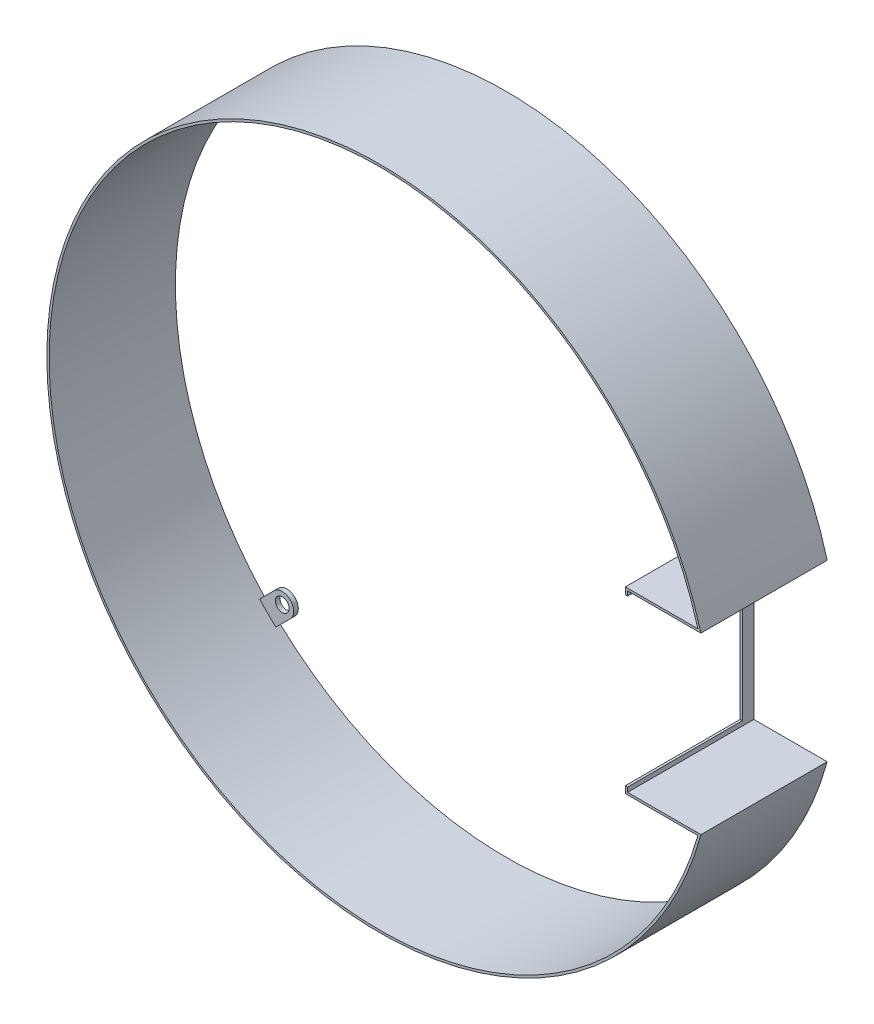
ISO-10303-21;
HEADER;
FILE_DESCRIPTION(('STEP AP214'),'2;1');
FILE_NAME('part.step','',(''),(''),'','','');
FILE_SCHEMA(('AUTOMOTIVE_DESIGN { 1 0 10303 214 1 1 1 1 }'));
ENDSEC;
DATA;
#1=APPLICATION_CONTEXT('core data for automotive mechanical design processes');
#2=APPLICATION_PROTOCOL_DEFINITION('international standard','automotive_design',2000,#1);
#3=PRODUCT_CONTEXT('',#1,'mechanical');
#4=PRODUCT('Part','Part','',(#3));
#5=PRODUCT_RELATED_PRODUCT_CATEGORY('part','',(#4));
#6=PRODUCT_DEFINITION_FORMATION('','',#4);
#7=PRODUCT_DEFINITION_CONTEXT('part definition',#1,'design');
#8=PRODUCT_DEFINITION('design','',#6,#7);
#9=PRODUCT_DEFINITION_SHAPE('','',#8);
#10=(LENGTH_UNIT() NAMED_UNIT(*) SI_UNIT(.MILLI.,.METRE.));
#11=(NAMED_UNIT(*) PLANE_ANGLE_UNIT() SI_UNIT($,.RADIAN.));
#12=(NAMED_UNIT(*) SI_UNIT($,.STERADIAN.) SOLID_ANGLE_UNIT());
#13=UNCERTAINTY_MEASURE_WITH_UNIT(LENGTH_MEASURE(1.E-05),#10,'distance_accuracy_value','');
#14=(GEOMETRIC_REPRESENTATION_CONTEXT(3) GLOBAL_UNCERTAINTY_ASSIGNED_CONTEXT((#13)) GLOBAL_UNIT_ASSIGNED_CONTEXT((#10,
#11,#12)) REPRESENTATION_CONTEXT('',''));
#15=CARTESIAN_POINT('',(0.,0.,0.));
#16=DIRECTION('',(0.,0.,1.));
#17=DIRECTION('',(1.,0.,0.));
#18=AXIS2_PLACEMENT_3D('',#15,#16,#17);
#19=CARTESIAN_POINT('',(0.,0.,27.5));
#20=DIRECTION('',(0.,0.,-1.));
#21=DIRECTION('',(-1.,0.,0.));
#22=AXIS2_PLACEMENT_3D('',#19,#20,#21);
#23=CYLINDRICAL_SURFACE('',#22,72.);
#24=DIRECTION('',(0.,0.,-1.));
#25=VECTOR('',#24,1.);
#26=CARTESIAN_POINT('',(49.1132216380591,-52.6487555439906,1.));
#27=LINE('',#26,#25);
#28=CARTESIAN_POINT('',(49.1132216380591,-52.6487555439906,1.));
#29=VERTEX_POINT('',#28);
#30=CARTESIAN_POINT('',(49.1132216380591,-52.6487555439906,0.));
#31=VERTEX_POINT('',#30);
#32=EDGE_CURVE('E252',#29,#31,#27,.T.);
#33=ORIENTED_EDGE('',*,*,#32,.T.);
#34=CARTESIAN_POINT('',(0.,0.,0.));
#35=DIRECTION('',(0.,0.,-1.));
#36=DIRECTION('',(1.,0.,0.));
#37=AXIS2_PLACEMENT_3D('',#34,#35,#36);
#38=CIRCLE('',#37,72.);
#39=CARTESIAN_POINT('',(-49.1132216380584,-52.6487555439913,0.));
#40=VERTEX_POINT('',#39);
#41=EDGE_CURVE('E430',#31,#40,#38,.T.);
#42=ORIENTED_EDGE('',*,*,#41,.T.);
#43=DIRECTION('',(0.,0.,-1.));
#44=VECTOR('',#43,1.);
#45=CARTESIAN_POINT('',(-49.1132216380584,-52.6487555439913,1.));
#46=LINE('',#45,#44);
#47=CARTESIAN_POINT('',(-49.1132216380584,-52.6487555439913,1.));
#48=VERTEX_POINT('',#47);
#49=EDGE_CURVE('E283',#48,#40,#46,.T.);
#50=ORIENTED_EDGE('',*,*,#49,.F.);
#51=CARTESIAN_POINT('',(0.,0.,1.));
#52=DIRECTION('',(0.,0.,1.));
#53=DIRECTION('',(-1.,0.,0.));
#54=AXIS2_PLACEMENT_3D('',#51,#52,#53);
#55=CIRCLE('',#54,72.);
#56=CARTESIAN_POINT('',(-52.6487555439911,-49.1132216380586,1.));
#57=VERTEX_POINT('',#56);
#58=EDGE_CURVE('E262',#57,#48,#55,.T.);
#59=ORIENTED_EDGE('',*,*,#58,.F.);
#60=DIRECTION('',(0.,0.,-1.));
#61=VECTOR('',#60,1.);
#62=CARTESIAN_POINT('',(-52.6487555439911,-49.1132216380586,1.));
#63=LINE('',#62,#61);
#64=CARTESIAN_POINT('',(-52.6487555439911,-49.1132216380586,0.));
#65=VERTEX_POINT('',#64);
#66=EDGE_CURVE('E286',#57,#65,#63,.T.);
#67=ORIENTED_EDGE('',*,*,#66,.T.);
#68=CARTESIAN_POINT('',(-52.6487555439915,49.1132216380582,0.));
#69=VERTEX_POINT('',#68);
#70=EDGE_CURVE('E763',#65,#69,#38,.T.);
#71=ORIENTED_EDGE('',*,*,#70,.T.);
#72=DIRECTION('',(0.,0.,-1.));
#73=VECTOR('',#72,1.);
#74=CARTESIAN_POINT('',(-52.6487555439915,49.1132216380582,1.));
#75=LINE('',#74,#73);
#76=CARTESIAN_POINT('',(-52.6487555439915,49.1132216380582,1.));
#77=VERTEX_POINT('',#76);
#78=EDGE_CURVE('E318',#77,#69,#75,.T.);
#79=ORIENTED_EDGE('',*,*,#78,.F.);
#80=CARTESIAN_POINT('',(0.,0.,1.));
#81=DIRECTION('',(0.,0.,1.));
#82=DIRECTION('',(0.,1.,0.));
#83=AXIS2_PLACEMENT_3D('',#80,#81,#82);
#84=CIRCLE('',#83,72.);
#85=CARTESIAN_POINT('',(-49.1132216380588,52.6487555439909,1.));
#86=VERTEX_POINT('',#85);
#87=EDGE_CURVE('E297',#86,#77,#84,.T.);
#88=ORIENTED_EDGE('',*,*,#87,.F.);
#89=DIRECTION('',(0.,0.,-1.));
#90=VECTOR('',#89,1.);
#91=CARTESIAN_POINT('',(-49.1132216380588,52.6487555439909,1.));
#92=LINE('',#91,#90);
#93=CARTESIAN_POINT('',(-49.1132216380588,52.6487555439909,0.));
#94=VERTEX_POINT('',#93);
#95=EDGE_CURVE('E321',#86,#94,#92,.T.);
#96=ORIENTED_EDGE('',*,*,#95,.T.);
#97=CARTESIAN_POINT('',(49.1132216380584,52.6487555439913,0.));
#98=VERTEX_POINT('',#97);
#99=EDGE_CURVE('E774',#94,#98,#38,.T.);
#100=ORIENTED_EDGE('',*,*,#99,.T.);
#101=DIRECTION('',(0.,0.,-1.));
#102=VECTOR('',#101,1.);
#103=CARTESIAN_POINT('',(49.1132216380584,52.6487555439913,1.));
#104=LINE('',#103,#102);
#105=CARTESIAN_POINT('',(49.1132216380584,52.6487555439913,1.));
#106=VERTEX_POINT('',#105);
#107=EDGE_CURVE('E353',#106,#98,#104,.T.);
#108=ORIENTED_EDGE('',*,*,#107,.F.);
#109=CARTESIAN_POINT('',(0.,0.,1.));
#110=DIRECTION('',(0.,0.,1.));
#111=DIRECTION('',(1.,0.,0.));
#112=AXIS2_PLACEMENT_3D('',#109,#110,#111);
#113=CIRCLE('',#112,72.);
#114=CARTESIAN_POINT('',(52.6487555439911,49.1132216380586,1.));
#115=VERTEX_POINT('',#114);
#116=EDGE_CURVE('E332',#115,#106,#113,.T.);
#117=ORIENTED_EDGE('',*,*,#116,.F.);
#118=DIRECTION('',(0.,0.,-1.));
#119=VECTOR('',#118,1.);
#120=CARTESIAN_POINT('',(52.6487555439911,49.1132216380586,1.));
#121=LINE('',#120,#119);
#122=CARTESIAN_POINT('',(52.6487555439911,49.1132216380586,0.));
#123=VERTEX_POINT('',#122);
#124=EDGE_CURVE('E356',#115,#123,#121,.T.);
#125=ORIENTED_EDGE('',*,*,#124,.T.);
#126=CARTESIAN_POINT('',(69.3090903128875,19.5,0.));
#127=VERTEX_POINT('',#126);
#128=EDGE_CURVE('E426',#123,#127,#38,.T.);
#129=ORIENTED_EDGE('',*,*,#128,.T.);
#130=DIRECTION('',(0.,0.,-1.));
#131=VECTOR('',#130,1.);
#132=CARTESIAN_POINT('',(69.3090903128875,19.5,27.5));
#133=LINE('',#132,#131);
#134=CARTESIAN_POINT('',(69.3090903128875,19.5,27.5));
#135=VERTEX_POINT('',#134);
#136=EDGE_CURVE('E445',#135,#127,#133,.T.);
#137=ORIENTED_EDGE('',*,*,#136,.F.);
#138=CARTESIAN_POINT('',(0.,0.,27.5));
#139=DIRECTION('',(0.,0.,-1.));
#140=DIRECTION('',(1.,0.,0.));
#141=AXIS2_PLACEMENT_3D('',#138,#139,#140);
#142=CIRCLE('',#141,72.);
#143=CARTESIAN_POINT('',(69.3090903128875,-19.5,27.5));
#144=VERTEX_POINT('',#143);
#145=EDGE_CURVE('E412',#144,#135,#142,.T.);
#146=ORIENTED_EDGE('',*,*,#145,.F.);
#147=DIRECTION('',(0.,0.,-1.));
#148=VECTOR('',#147,1.);
#149=CARTESIAN_POINT('',(69.3090903128875,-19.5,27.5));
#150=LINE('',#149,#148);
#151=CARTESIAN_POINT('',(69.3090903128875,-19.5,0.));
#152=VERTEX_POINT('',#151);
#153=EDGE_CURVE('E383',#144,#152,#150,.T.);
#154=ORIENTED_EDGE('',*,*,#153,.T.);
#155=CARTESIAN_POINT('',(52.6487555439918,-49.1132216380578,0.));
#156=VERTEX_POINT('',#155);
#157=EDGE_CURVE('E427',#152,#156,#38,.T.);
#158=ORIENTED_EDGE('',*,*,#157,.T.);
#159=DIRECTION('',(0.,0.,-1.));
#160=VECTOR('',#159,1.);
#161=CARTESIAN_POINT('',(52.6487555439918,-49.1132216380578,1.));
#162=LINE('',#161,#160);
#163=CARTESIAN_POINT('',(52.6487555439918,-49.1132216380578,1.));
#164=VERTEX_POINT('',#163);
#165=EDGE_CURVE('E55',#164,#156,#162,.T.);
#166=ORIENTED_EDGE('',*,*,#165,.F.);
#167=CARTESIAN_POINT('',(0.,0.,1.));
#168=DIRECTION('',(0.,0.,1.));
#169=DIRECTION('',(0.,-1.,0.));
#170=AXIS2_PLACEMENT_3D('',#167,#168,#169);
#171=CIRCLE('',#170,72.);
#172=EDGE_CURVE('E50',#29,#164,#171,.T.);
#173=ORIENTED_EDGE('',*,*,#172,.F.);
#174=EDGE_LOOP('',(#33,#42,#50,#59,#67,#71,#79,#88,#96,#100,#108,#117,#125,#129,#137,#146,#154,
#158,#166,#173));
#175=FACE_BOUND('',#174,.T.);
#176=ADVANCED_FACE('F35',(#175),#23,.F.);
#177=CARTESIAN_POINT('',(53.5,19.5,27.5));
#178=DIRECTION('',(1.,0.,0.));
#179=DIRECTION('',(0.,0.,-1.));
#180=AXIS2_PLACEMENT_3D('',#177,#178,#179);
#181=PLANE('',#180);
#182=DIRECTION('',(0.,1.,0.));
#183=VECTOR('',#182,1.);
#184=CARTESIAN_POINT('',(53.5,-19.5,27.5));
#185=LINE('',#184,#183);
#186=CARTESIAN_POINT('',(53.5,-19.5,27.5));
#187=VERTEX_POINT('',#186);
#188=CARTESIAN_POINT('',(53.5,-18.,27.5));
#189=VERTEX_POINT('',#188);
#190=EDGE_CURVE('E377',#187,#189,#185,.T.);
#191=ORIENTED_EDGE('',*,*,#190,.T.);
#192=DIRECTION('',(0.,0.,1.));
#193=VECTOR('',#192,1.);
#194=CARTESIAN_POINT('',(53.5,-18.,27.5));
#195=LINE('',#194,#193);
#196=CARTESIAN_POINT('',(53.5,-18.,2.5));
#197=VERTEX_POINT('',#196);
#198=EDGE_CURVE('E359',#197,#189,#195,.T.);
#199=ORIENTED_EDGE('',*,*,#198,.F.);
#200=DIRECTION('',(0.,1.,0.));
#201=VECTOR('',#200,1.);
#202=CARTESIAN_POINT('',(53.5,18.,2.5));
#203=LINE('',#202,#201);
#204=CARTESIAN_POINT('',(53.5,18.,2.5));
#205=VERTEX_POINT('',#204);
#206=EDGE_CURVE('E399',#197,#205,#203,.T.);
#207=ORIENTED_EDGE('',*,*,#206,.T.);
#208=DIRECTION('',(0.,0.,1.));
#209=VECTOR('',#208,1.);
#210=CARTESIAN_POINT('',(53.5,18.,27.5));
#211=LINE('',#210,#209);
#212=CARTESIAN_POINT('',(53.5,18.,27.5));
#213=VERTEX_POINT('',#212);
#214=EDGE_CURVE('E402',#205,#213,#211,.T.);
#215=ORIENTED_EDGE('',*,*,#214,.T.);
#216=DIRECTION('',(0.,-1.,0.));
#217=VECTOR('',#216,1.);
#218=CARTESIAN_POINT('',(53.5,19.5,27.5));
#219=LINE('',#218,#217);
#220=CARTESIAN_POINT('',(53.5,19.5,27.5));
#221=VERTEX_POINT('',#220);
#222=EDGE_CURVE('E417',#221,#213,#219,.T.);
#223=ORIENTED_EDGE('',*,*,#222,.F.);
#224=DIRECTION('',(0.,0.,-1.));
#225=VECTOR('',#224,1.);
#226=CARTESIAN_POINT('',(53.5,19.5,27.5));
#227=LINE('',#226,#225);
#228=CARTESIAN_POINT('',(53.5,19.5,0.));
#229=VERTEX_POINT('',#228);
#230=EDGE_CURVE('E442',#221,#229,#227,.T.);
#231=ORIENTED_EDGE('',*,*,#230,.T.);
#232=DIRECTION('',(0.,-1.,0.));
#233=VECTOR('',#232,1.);
#234=CARTESIAN_POINT('',(53.5,19.5,0.));
#235=LINE('',#234,#233);
#236=CARTESIAN_POINT('',(53.5,-19.5,0.));
#237=VERTEX_POINT('',#236);
#238=EDGE_CURVE('E432',#229,#237,#235,.T.);
#239=ORIENTED_EDGE('',*,*,#238,.T.);
#240=DIRECTION('',(0.,0.,-1.));
#241=VECTOR('',#240,1.);
#242=CARTESIAN_POINT('',(53.5,-19.5,27.5));
#243=LINE('',#242,#241);
#244=EDGE_CURVE('E390',#187,#237,#243,.T.);
#245=ORIENTED_EDGE('',*,*,#244,.F.);
#246=EDGE_LOOP('',(#191,#199,#207,#215,#223,#231,#239,#245));
#247=FACE_BOUND('',#246,.T.);
#248=ADVANCED_FACE('F479',(#247),#181,.F.);
#249=CARTESIAN_POINT('',(54.,0.,27.5));
#250=DIRECTION('',(-1.,0.,0.));
#251=DIRECTION('',(0.,0.,1.));
#252=AXIS2_PLACEMENT_3D('',#249,#250,#251);
#253=PLANE('',#252);
#254=DIRECTION('',(0.,1.,0.));
#255=VECTOR('',#254,1.);
#256=CARTESIAN_POINT('',(54.,0.,2.5));
#257=LINE('',#256,#255);
#258=CARTESIAN_POINT('',(54.,-18.,2.5));
#259=VERTEX_POINT('',#258);
#260=CARTESIAN_POINT('',(54.,18.,2.5));
#261=VERTEX_POINT('',#260);
#262=EDGE_CURVE('E11',#259,#261,#257,.T.);
#263=ORIENTED_EDGE('',*,*,#262,.F.);
#264=DIRECTION('',(0.,0.,1.));
#265=VECTOR('',#264,1.);
#266=CARTESIAN_POINT('',(54.,-18.,27.5));
#267=LINE('',#266,#265);
#268=CARTESIAN_POINT('',(54.,-18.,27.5));
#269=VERTEX_POINT('',#268);
#270=EDGE_CURVE('E367',#259,#269,#267,.T.);
#271=ORIENTED_EDGE('',*,*,#270,.T.);
#272=DIRECTION('',(0.,-1.,0.));
#273=VECTOR('',#272,1.);
#274=CARTESIAN_POINT('',(54.,0.,27.5));
#275=LINE('',#274,#273);
#276=CARTESIAN_POINT('',(54.,-19.,27.5));
#277=VERTEX_POINT('',#276);
#278=EDGE_CURVE('E374',#269,#277,#275,.T.);
#279=ORIENTED_EDGE('',*,*,#278,.T.);
#280=DIRECTION('',(0.,0.,-1.));
#281=VECTOR('',#280,1.);
#282=CARTESIAN_POINT('',(54.,-19.,27.5));
#283=LINE('',#282,#281);
#284=CARTESIAN_POINT('',(54.,-19.,0.));
#285=VERTEX_POINT('',#284);
#286=EDGE_CURVE('E393',#277,#285,#283,.T.);
#287=ORIENTED_EDGE('',*,*,#286,.T.);
#288=DIRECTION('',(0.,1.,0.));
#289=VECTOR('',#288,1.);
#290=CARTESIAN_POINT('',(54.,0.,0.));
#291=LINE('',#290,#289);
#292=CARTESIAN_POINT('',(54.,19.,0.));
#293=VERTEX_POINT('',#292);
#294=EDGE_CURVE('E434',#285,#293,#291,.T.);
#295=ORIENTED_EDGE('',*,*,#294,.T.);
#296=DIRECTION('',(0.,0.,-1.));
#297=VECTOR('',#296,1.);
#298=CARTESIAN_POINT('',(54.,19.,27.5));
#299=LINE('',#298,#297);
#300=CARTESIAN_POINT('',(54.,19.,27.5));
#301=VERTEX_POINT('',#300);
#302=EDGE_CURVE('E439',#301,#293,#299,.T.);
#303=ORIENTED_EDGE('',*,*,#302,.F.);
#304=DIRECTION('',(0.,1.,0.));
#305=VECTOR('',#304,1.);
#306=CARTESIAN_POINT('',(54.,0.,27.5));
#307=LINE('',#306,#305);
#308=CARTESIAN_POINT('',(54.,18.,27.5));
#309=VERTEX_POINT('',#308);
#310=EDGE_CURVE('E420',#309,#301,#307,.T.);
#311=ORIENTED_EDGE('',*,*,#310,.F.);
#312=DIRECTION('',(0.,0.,1.));
#313=VECTOR('',#312,1.);
#314=CARTESIAN_POINT('',(54.,18.,27.5));
#315=LINE('',#314,#313);
#316=EDGE_CURVE('E407',#261,#309,#315,.T.);
#317=ORIENTED_EDGE('',*,*,#316,.F.);
#318=EDGE_LOOP('',(#263,#271,#279,#287,#295,#303,#311,#317));
#319=FACE_BOUND('',#318,.T.);
#320=ADVANCED_FACE('F457',(#319),#253,.F.);
#321=CARTESIAN_POINT('',(0.,0.,27.5));
#322=DIRECTION('',(0.,0.,1.));
#323=DIRECTION('',(1.,0.,0.));
#324=AXIS2_PLACEMENT_3D('',#321,#322,#323);
#325=PLANE('',#324);
#326=DIRECTION('',(-1.,0.,0.));
#327=VECTOR('',#326,1.);
#328=CARTESIAN_POINT('',(69.9660632020982,-18.,27.5));
#329=LINE('',#328,#327);
#330=EDGE_CURVE('E364',#269,#189,#329,.T.);
#331=ORIENTED_EDGE('',*,*,#330,.T.);
#332=ORIENTED_EDGE('',*,*,#190,.F.);
#333=DIRECTION('',(-1.,0.,0.));
#334=VECTOR('',#333,1.);
#335=CARTESIAN_POINT('',(69.3090903128875,-19.5,27.5));
#336=LINE('',#335,#334);
#337=EDGE_CURVE('E380',#144,#187,#336,.T.);
#338=ORIENTED_EDGE('',*,*,#337,.F.);
#339=ORIENTED_EDGE('',*,*,#145,.T.);
#340=DIRECTION('',(-1.,0.,0.));
#341=VECTOR('',#340,1.);
#342=CARTESIAN_POINT('',(69.3090903128875,19.5,27.5));
#343=LINE('',#342,#341);
#344=EDGE_CURVE('E415',#135,#221,#343,.T.);
#345=ORIENTED_EDGE('',*,*,#344,.T.);
#346=ORIENTED_EDGE('',*,*,#222,.T.);
#347=DIRECTION('',(1.,0.,0.));
#348=VECTOR('',#347,1.);
#349=CARTESIAN_POINT('',(0.,18.,27.5));
#350=LINE('',#349,#348);
#351=EDGE_CURVE('E43',#213,#309,#350,.T.);
#352=ORIENTED_EDGE('',*,*,#351,.T.);
#353=ORIENTED_EDGE('',*,*,#310,.T.);
#354=DIRECTION('',(1.,0.,0.));
#355=VECTOR('',#354,1.);
#356=CARTESIAN_POINT('',(54.,19.,27.5));
#357=LINE('',#356,#355);
#358=CARTESIAN_POINT('',(69.9660632020982,19.,27.5));
#359=VERTEX_POINT('',#358);
#360=EDGE_CURVE('E422',#301,#359,#357,.T.);
#361=ORIENTED_EDGE('',*,*,#360,.T.);
#362=CARTESIAN_POINT('',(0.,0.,27.5));
#363=DIRECTION('',(0.,0.,1.));
#364=DIRECTION('',(1.,0.,0.));
#365=AXIS2_PLACEMENT_3D('',#362,#363,#364);
#366=CIRCLE('',#365,72.5);
#367=CARTESIAN_POINT('',(69.9660632020982,-19.,27.5));
#368=VERTEX_POINT('',#367);
#369=EDGE_CURVE('E410',#359,#368,#366,.T.);
#370=ORIENTED_EDGE('',*,*,#369,.T.);
#371=DIRECTION('',(1.,0.,0.));
#372=VECTOR('',#371,1.);
#373=CARTESIAN_POINT('',(54.,-19.,27.5));
#374=LINE('',#373,#372);
#375=EDGE_CURVE('E371',#277,#368,#374,.T.);
#376=ORIENTED_EDGE('',*,*,#375,.F.);
#377=ORIENTED_EDGE('',*,*,#278,.F.);
#378=EDGE_LOOP('',(#331,#332,#338,#339,#345,#346,#352,#353,#361,#370,#376,#377));
#379=FACE_BOUND('',#378,.T.);
#380=ADVANCED_FACE('F450',(#379),#325,.T.);
#381=CARTESIAN_POINT('',(0.,0.,27.5));
#382=DIRECTION('',(0.,0.,-1.));
#383=DIRECTION('',(-1.,0.,0.));
#384=AXIS2_PLACEMENT_3D('',#381,#382,#383);
#385=CYLINDRICAL_SURFACE('',#384,72.5);
#386=CARTESIAN_POINT('',(0.,0.,0.));
#387=DIRECTION('',(0.,0.,1.));
#388=DIRECTION('',(1.,0.,0.));
#389=AXIS2_PLACEMENT_3D('',#386,#387,#388);
#390=CIRCLE('',#389,72.5);
#391=CARTESIAN_POINT('',(69.9660632020982,19.,0.));
#392=VERTEX_POINT('',#391);
#393=CARTESIAN_POINT('',(69.9660632020982,-19.,0.));
#394=VERTEX_POINT('',#393);
#395=EDGE_CURVE('E409',#392,#394,#390,.T.);
#396=ORIENTED_EDGE('',*,*,#395,.T.);
#397=DIRECTION('',(0.,0.,-1.));
#398=VECTOR('',#397,1.);
#399=CARTESIAN_POINT('',(69.9660632020982,-19.,27.5));
#400=LINE('',#399,#398);
#401=EDGE_CURVE('E396',#368,#394,#400,.T.);
#402=ORIENTED_EDGE('',*,*,#401,.F.);
#403=ORIENTED_EDGE('',*,*,#369,.F.);
#404=DIRECTION('',(0.,0.,-1.));
#405=VECTOR('',#404,1.);
#406=CARTESIAN_POINT('',(69.9660632020982,19.,27.5));
#407=LINE('',#406,#405);
#408=EDGE_CURVE('E424',#359,#392,#407,.T.);
#409=ORIENTED_EDGE('',*,*,#408,.T.);
#410=EDGE_LOOP('',(#396,#402,#403,#409));
#411=FACE_BOUND('',#410,.T.);
#412=ADVANCED_FACE('F37',(#411),#385,.T.);
#413=CARTESIAN_POINT('',(69.3090903128875,19.5,27.5));
#414=DIRECTION('',(0.,-1.,0.));
#415=DIRECTION('',(0.,0.,-1.));
#416=AXIS2_PLACEMENT_3D('',#413,#414,#415);
#417=PLANE('',#416);
#418=DIRECTION('',(-1.,0.,0.));
#419=VECTOR('',#418,1.);
#420=CARTESIAN_POINT('',(69.3090903128875,19.5,0.));
#421=LINE('',#420,#419);
#422=EDGE_CURVE('E429',#127,#229,#421,.T.);
#423=ORIENTED_EDGE('',*,*,#422,.T.);
#424=ORIENTED_EDGE('',*,*,#230,.F.);
#425=ORIENTED_EDGE('',*,*,#344,.F.);
#426=ORIENTED_EDGE('',*,*,#136,.T.);
#427=EDGE_LOOP('',(#423,#424,#425,#426));
#428=FACE_BOUND('',#427,.T.);
#429=ADVANCED_FACE('F493',(#428),#417,.F.);
#430=CARTESIAN_POINT('',(54.,19.,27.5));
#431=DIRECTION('',(0.,1.,0.));
#432=DIRECTION('',(-1.,0.,0.));
#433=AXIS2_PLACEMENT_3D('',#430,#431,#432);
#434=PLANE('',#433);
#435=DIRECTION('',(1.,0.,0.));
#436=VECTOR('',#435,1.);
#437=CARTESIAN_POINT('',(54.,19.,0.));
#438=LINE('',#437,#436);
#439=EDGE_CURVE('E413',#293,#392,#438,.T.);
#440=ORIENTED_EDGE('',*,*,#439,.T.);
#441=ORIENTED_EDGE('',*,*,#408,.F.);
#442=ORIENTED_EDGE('',*,*,#360,.F.);
#443=ORIENTED_EDGE('',*,*,#302,.T.);
#444=EDGE_LOOP('',(#440,#441,#442,#443));
#445=FACE_BOUND('',#444,.T.);
#446=ADVANCED_FACE('F462',(#445),#434,.F.);
#447=CARTESIAN_POINT('',(0.,0.,0.));
#448=DIRECTION('',(0.,0.,1.));
#449=DIRECTION('',(1.,0.,0.));
#450=AXIS2_PLACEMENT_3D('',#447,#448,#449);
#451=PLANE('',#450);
#452=ORIENTED_EDGE('',*,*,#294,.F.);
#453=DIRECTION('',(1.,0.,0.));
#454=VECTOR('',#453,1.);
#455=CARTESIAN_POINT('',(54.,-19.,0.));
#456=LINE('',#455,#454);
#457=EDGE_CURVE('E370',#285,#394,#456,.T.);
#458=ORIENTED_EDGE('',*,*,#457,.T.);
#459=ORIENTED_EDGE('',*,*,#395,.F.);
#460=ORIENTED_EDGE('',*,*,#439,.F.);
#461=EDGE_LOOP('',(#452,#458,#459,#460));
#462=FACE_BOUND('',#461,.T.);
#463=DIRECTION('',(-1.,0.,0.));
#464=VECTOR('',#463,1.);
#465=CARTESIAN_POINT('',(69.3090903128875,-19.5,0.));
#466=LINE('',#465,#464);
#467=EDGE_CURVE('E375',#152,#237,#466,.T.);
#468=ORIENTED_EDGE('',*,*,#467,.T.);
#469=ORIENTED_EDGE('',*,*,#238,.F.);
#470=ORIENTED_EDGE('',*,*,#422,.F.);
#471=ORIENTED_EDGE('',*,*,#128,.F.);
#472=DIRECTION('',(0.707106781186546,0.707106781186549,0.));
#473=VECTOR('',#472,1.);
#474=CARTESIAN_POINT('',(1.76776695296636,-1.76776695296636,0.));
#475=LINE('',#474,#473);
#476=CARTESIAN_POINT('',(49.4974746830582,45.9619407771257,0.));
#477=VERTEX_POINT('',#476);
#478=EDGE_CURVE('E342',#477,#123,#475,.T.);
#479=ORIENTED_EDGE('',*,*,#478,.F.);
#480=CARTESIAN_POINT('',(47.729707730092,47.729707730092,0.));
#481=DIRECTION('',(0.,0.,1.));
#482=DIRECTION('',(1.,0.,0.));
#483=AXIS2_PLACEMENT_3D('',#480,#481,#482);
#484=CIRCLE('',#483,2.49999999999999);
#485=CARTESIAN_POINT('',(45.9619407771255,49.4974746830584,0.));
#486=VERTEX_POINT('',#485);
#487=EDGE_CURVE('E329',#486,#477,#484,.T.);
#488=ORIENTED_EDGE('',*,*,#487,.F.);
#489=DIRECTION('',(-0.707106781186546,-0.707106781186549,0.));
#490=VECTOR('',#489,1.);
#491=CARTESIAN_POINT('',(-1.76776695296636,1.76776695296636,0.));
#492=LINE('',#491,#490);
#493=EDGE_CURVE('E345',#98,#486,#492,.T.);
#494=ORIENTED_EDGE('',*,*,#493,.F.);
#495=ORIENTED_EDGE('',*,*,#99,.F.);
#496=DIRECTION('',(-0.707106781186551,0.707106781186544,0.));
#497=VECTOR('',#496,1.);
#498=CARTESIAN_POINT('',(1.76776695296635,1.76776695296637,0.));
#499=LINE('',#498,#497);
#500=CARTESIAN_POINT('',(-45.9619407771259,49.4974746830581,0.));
#501=VERTEX_POINT('',#500);
#502=EDGE_CURVE('E307',#501,#94,#499,.T.);
#503=ORIENTED_EDGE('',*,*,#502,.F.);
#504=CARTESIAN_POINT('',(-47.7297077300921,47.7297077300918,0.));
#505=DIRECTION('',(0.,0.,1.));
#506=DIRECTION('',(0.,1.,0.));
#507=AXIS2_PLACEMENT_3D('',#504,#505,#506);
#508=CIRCLE('',#507,2.49999999999999);
#509=CARTESIAN_POINT('',(-49.4974746830586,45.9619407771253,0.));
#510=VERTEX_POINT('',#509);
#511=EDGE_CURVE('E294',#510,#501,#508,.T.);
#512=ORIENTED_EDGE('',*,*,#511,.F.);
#513=DIRECTION('',(0.707106781186551,-0.707106781186544,0.));
#514=VECTOR('',#513,1.);
#515=CARTESIAN_POINT('',(-1.76776695296635,-1.76776695296637,0.));
#516=LINE('',#515,#514);
#517=EDGE_CURVE('E310',#69,#510,#516,.T.);
#518=ORIENTED_EDGE('',*,*,#517,.F.);
#519=ORIENTED_EDGE('',*,*,#70,.F.);
#520=DIRECTION('',(-0.707106781186546,-0.707106781186549,0.));
#521=VECTOR('',#520,1.);
#522=CARTESIAN_POINT('',(-1.76776695296636,1.76776695296636,0.));
#523=LINE('',#522,#521);
#524=CARTESIAN_POINT('',(-49.4974746830582,-45.9619407771257,0.));
#525=VERTEX_POINT('',#524);
#526=EDGE_CURVE('E272',#525,#65,#523,.T.);
#527=ORIENTED_EDGE('',*,*,#526,.F.);
#528=CARTESIAN_POINT('',(-47.729707730092,-47.729707730092,0.));
#529=DIRECTION('',(0.,0.,1.));
#530=DIRECTION('',(-1.,0.,0.));
#531=AXIS2_PLACEMENT_3D('',#528,#529,#530);
#532=CIRCLE('',#531,2.49999999999999);
#533=CARTESIAN_POINT('',(-45.9619407771255,-49.4974746830584,0.));
#534=VERTEX_POINT('',#533);
#535=EDGE_CURVE('E259',#534,#525,#532,.T.);
#536=ORIENTED_EDGE('',*,*,#535,.F.);
#537=DIRECTION('',(0.707106781186546,0.707106781186549,0.));
#538=VECTOR('',#537,1.);
#539=CARTESIAN_POINT('',(1.76776695296636,-1.76776695296636,0.));
#540=LINE('',#539,#538);
#541=EDGE_CURVE('E275',#40,#534,#540,.T.);
#542=ORIENTED_EDGE('',*,*,#541,.F.);
#543=ORIENTED_EDGE('',*,*,#41,.F.);
#544=DIRECTION('',(0.707106781186556,-0.707106781186539,0.));
#545=VECTOR('',#544,1.);
#546=CARTESIAN_POINT('',(-1.76776695296634,-1.76776695296638,0.));
#547=LINE('',#546,#545);
#548=CARTESIAN_POINT('',(45.9619407771262,-49.4974746830577,0.));
#549=VERTEX_POINT('',#548);
#550=EDGE_CURVE('E244',#549,#31,#547,.T.);
#551=ORIENTED_EDGE('',*,*,#550,.F.);
#552=CARTESIAN_POINT('',(47.7297077300925,-47.7297077300915,0.));
#553=DIRECTION('',(0.,0.,1.));
#554=DIRECTION('',(0.,-1.,0.));
#555=AXIS2_PLACEMENT_3D('',#552,#553,#554);
#556=CIRCLE('',#555,2.49999999999999);
#557=CARTESIAN_POINT('',(49.4974746830589,-45.961940777125,0.));
#558=VERTEX_POINT('',#557);
#559=EDGE_CURVE('E248',#558,#549,#556,.T.);
#560=ORIENTED_EDGE('',*,*,#559,.F.);
#561=DIRECTION('',(-0.707106781186556,0.707106781186539,0.));
#562=VECTOR('',#561,1.);
#563=CARTESIAN_POINT('',(1.76776695296634,1.76776695296638,0.));
#564=LINE('',#563,#562);
#565=EDGE_CURVE('E229',#156,#558,#564,.T.);
#566=ORIENTED_EDGE('',*,*,#565,.F.);
#567=ORIENTED_EDGE('',*,*,#157,.F.);
#568=EDGE_LOOP('',(#468,#469,#470,#471,#479,#488,#494,#495,#503,#512,#518,#519,#527,#536,#542,
#543,#551,#560,#566,#567));
#569=FACE_BOUND('',#568,.T.);
#570=CARTESIAN_POINT('',(47.729707730092,47.729707730092,0.));
#571=DIRECTION('',(0.,0.,1.));
#572=DIRECTION('',(1.,0.,0.));
#573=AXIS2_PLACEMENT_3D('',#570,#571,#572);
#574=CIRCLE('',#573,1.5);
#575=CARTESIAN_POINT('',(49.229707730092,47.729707730092,0.));
#576=VERTEX_POINT('',#575);
#577=EDGE_CURVE('E324',#576,#576,#574,.T.);
#578=ORIENTED_EDGE('',*,*,#577,.T.);
#579=EDGE_LOOP('',(#578));
#580=FACE_BOUND('',#579,.T.);
#581=CARTESIAN_POINT('',(-47.7297077300921,47.7297077300918,0.));
#582=DIRECTION('',(0.,0.,1.));
#583=DIRECTION('',(0.,1.,0.));
#584=AXIS2_PLACEMENT_3D('',#581,#582,#583);
#585=CIRCLE('',#584,1.5);
#586=CARTESIAN_POINT('',(-47.7297077300921,49.2297077300918,0.));
#587=VERTEX_POINT('',#586);
#588=EDGE_CURVE('E289',#587,#587,#585,.T.);
#589=ORIENTED_EDGE('',*,*,#588,.T.);
#590=EDGE_LOOP('',(#589));
#591=FACE_BOUND('',#590,.T.);
#592=CARTESIAN_POINT('',(-47.729707730092,-47.729707730092,0.));
#593=DIRECTION('',(0.,0.,1.));
#594=DIRECTION('',(-1.,0.,0.));
#595=AXIS2_PLACEMENT_3D('',#592,#593,#594);
#596=CIRCLE('',#595,1.5);
#597=CARTESIAN_POINT('',(-49.229707730092,-47.729707730092,0.));
#598=VERTEX_POINT('',#597);
#599=EDGE_CURVE('E254',#598,#598,#596,.T.);
#600=ORIENTED_EDGE('',*,*,#599,.T.);
#601=EDGE_LOOP('',(#600));
#602=FACE_BOUND('',#601,.T.);
#603=CARTESIAN_POINT('',(47.7297077300925,-47.7297077300915,0.));
#604=DIRECTION('',(0.,0.,1.));
#605=DIRECTION('',(0.,-1.,0.));
#606=AXIS2_PLACEMENT_3D('',#603,#604,#605);
#607=CIRCLE('',#606,1.5);
#608=CARTESIAN_POINT('',(47.7297077300925,-49.2297077300915,0.));
#609=VERTEX_POINT('',#608);
#610=EDGE_CURVE('E241',#609,#609,#607,.T.);
#611=ORIENTED_EDGE('',*,*,#610,.T.);
#612=EDGE_LOOP('',(#611));
#613=FACE_BOUND('',#612,.T.);
#614=ADVANCED_FACE('F486',(#462,#569,#580,#591,#602,#613),#451,.F.);
#615=CARTESIAN_POINT('',(69.9660632020982,18.,2.5));
#616=DIRECTION('',(0.,0.,1.));
#617=DIRECTION('',(0.,-1.,0.));
#618=AXIS2_PLACEMENT_3D('',#615,#616,#617);
#619=PLANE('',#618);
#620=ORIENTED_EDGE('',*,*,#262,.T.);
#621=DIRECTION('',(-1.,0.,0.));
#622=VECTOR('',#621,1.);
#623=CARTESIAN_POINT('',(69.9660632020982,18.,2.5));
#624=LINE('',#623,#622);
#625=EDGE_CURVE('E405',#261,#205,#624,.T.);
#626=ORIENTED_EDGE('',*,*,#625,.T.);
#627=ORIENTED_EDGE('',*,*,#206,.F.);
#628=DIRECTION('',(-1.,0.,0.));
#629=VECTOR('',#628,1.);
#630=CARTESIAN_POINT('',(69.9660632020982,-18.,2.5));
#631=LINE('',#630,#629);
#632=EDGE_CURVE('E361',#259,#197,#631,.T.);
#633=ORIENTED_EDGE('',*,*,#632,.F.);
#634=EDGE_LOOP('',(#620,#626,#627,#633));
#635=FACE_BOUND('',#634,.T.);
#636=ADVANCED_FACE('F497',(#635),#619,.T.);
#637=CARTESIAN_POINT('',(69.9660632020982,18.,27.5));
#638=DIRECTION('',(0.,-1.,0.));
#639=DIRECTION('',(0.,0.,-1.));
#640=AXIS2_PLACEMENT_3D('',#637,#638,#639);
#641=PLANE('',#640);
#642=ORIENTED_EDGE('',*,*,#316,.T.);
#643=ORIENTED_EDGE('',*,*,#351,.F.);
#644=ORIENTED_EDGE('',*,*,#214,.F.);
#645=ORIENTED_EDGE('',*,*,#625,.F.);
#646=EDGE_LOOP('',(#642,#643,#644,#645));
#647=FACE_BOUND('',#646,.T.);
#648=ADVANCED_FACE('F495',(#647),#641,.T.);
#649=CARTESIAN_POINT('',(54.,-19.,27.5));
#650=DIRECTION('',(0.,1.,0.));
#651=DIRECTION('',(-1.,0.,0.));
#652=AXIS2_PLACEMENT_3D('',#649,#650,#651);
#653=PLANE('',#652);
#654=ORIENTED_EDGE('',*,*,#457,.F.);
#655=ORIENTED_EDGE('',*,*,#286,.F.);
#656=ORIENTED_EDGE('',*,*,#375,.T.);
#657=ORIENTED_EDGE('',*,*,#401,.T.);
#658=EDGE_LOOP('',(#654,#655,#656,#657));
#659=FACE_BOUND('',#658,.T.);
#660=ADVANCED_FACE('F472',(#659),#653,.T.);
#661=CARTESIAN_POINT('',(69.3090903128875,-19.5,27.5));
#662=DIRECTION('',(0.,-1.,0.));
#663=DIRECTION('',(0.,0.,-1.));
#664=AXIS2_PLACEMENT_3D('',#661,#662,#663);
#665=PLANE('',#664);
#666=ORIENTED_EDGE('',*,*,#467,.F.);
#667=ORIENTED_EDGE('',*,*,#153,.F.);
#668=ORIENTED_EDGE('',*,*,#337,.T.);
#669=ORIENTED_EDGE('',*,*,#244,.T.);
#670=EDGE_LOOP('',(#666,#667,#668,#669));
#671=FACE_BOUND('',#670,.T.);
#672=ADVANCED_FACE('F483',(#671),#665,.T.);
#673=CARTESIAN_POINT('',(69.9660632020982,-18.,27.5));
#674=DIRECTION('',(0.,-1.,0.));
#675=DIRECTION('',(0.,0.,-1.));
#676=AXIS2_PLACEMENT_3D('',#673,#674,#675);
#677=PLANE('',#676);
#678=ORIENTED_EDGE('',*,*,#632,.T.);
#679=ORIENTED_EDGE('',*,*,#198,.T.);
#680=ORIENTED_EDGE('',*,*,#330,.F.);
#681=ORIENTED_EDGE('',*,*,#270,.F.);
#682=EDGE_LOOP('',(#678,#679,#680,#681));
#683=FACE_BOUND('',#682,.T.);
#684=ADVANCED_FACE('F499',(#683),#677,.F.);
#685=CARTESIAN_POINT('',(1.76776695296636,-1.76776695296636,1.));
#686=DIRECTION('',(-0.707106781186549,0.707106781186546,0.));
#687=DIRECTION('',(-0.707106781186546,-0.707106781186549,0.));
#688=AXIS2_PLACEMENT_3D('',#685,#686,#687);
#689=PLANE('',#688);
#690=ORIENTED_EDGE('',*,*,#478,.T.);
#691=ORIENTED_EDGE('',*,*,#124,.F.);
#692=DIRECTION('',(0.707106781186546,0.707106781186549,0.));
#693=VECTOR('',#692,1.);
#694=CARTESIAN_POINT('',(1.76776695296636,-1.76776695296636,1.));
#695=LINE('',#694,#693);
#696=CARTESIAN_POINT('',(49.4974746830582,45.9619407771257,1.));
#697=VERTEX_POINT('',#696);
#698=EDGE_CURVE('E328',#697,#115,#695,.T.);
#699=ORIENTED_EDGE('',*,*,#698,.F.);
#700=DIRECTION('',(0.,0.,-1.));
#701=VECTOR('',#700,1.);
#702=CARTESIAN_POINT('',(49.4974746830582,45.9619407771257,1.));
#703=LINE('',#702,#701);
#704=EDGE_CURVE('E339',#697,#477,#703,.T.);
#705=ORIENTED_EDGE('',*,*,#704,.T.);
#706=EDGE_LOOP('',(#690,#691,#699,#705));
#707=FACE_BOUND('',#706,.T.);
#708=ADVANCED_FACE('F501',(#707),#689,.F.);
#709=CARTESIAN_POINT('',(-1.76776695296636,1.76776695296636,1.));
#710=DIRECTION('',(0.707106781186549,-0.707106781186546,0.));
#711=DIRECTION('',(0.707106781186546,0.707106781186549,0.));
#712=AXIS2_PLACEMENT_3D('',#709,#710,#711);
#713=PLANE('',#712);
#714=ORIENTED_EDGE('',*,*,#493,.T.);
#715=DIRECTION('',(0.,0.,-1.));
#716=VECTOR('',#715,1.);
#717=CARTESIAN_POINT('',(45.9619407771255,49.4974746830584,1.));
#718=LINE('',#717,#716);
#719=CARTESIAN_POINT('',(45.9619407771255,49.4974746830584,1.));
#720=VERTEX_POINT('',#719);
#721=EDGE_CURVE('E350',#720,#486,#718,.T.);
#722=ORIENTED_EDGE('',*,*,#721,.F.);
#723=DIRECTION('',(-0.707106781186546,-0.707106781186549,0.));
#724=VECTOR('',#723,1.);
#725=CARTESIAN_POINT('',(-1.76776695296636,1.76776695296636,1.));
#726=LINE('',#725,#724);
#727=EDGE_CURVE('E335',#106,#720,#726,.T.);
#728=ORIENTED_EDGE('',*,*,#727,.F.);
#729=ORIENTED_EDGE('',*,*,#107,.T.);
#730=EDGE_LOOP('',(#714,#722,#728,#729));
#731=FACE_BOUND('',#730,.T.);
#732=ADVANCED_FACE('F507',(#731),#713,.F.);
#733=CARTESIAN_POINT('',(47.729707730092,47.729707730092,1.));
#734=DIRECTION('',(0.,0.,-1.));
#735=DIRECTION('',(-1.,0.,0.));
#736=AXIS2_PLACEMENT_3D('',#733,#734,#735);
#737=CYLINDRICAL_SURFACE('',#736,1.5);
#738=CARTESIAN_POINT('',(47.729707730092,47.729707730092,1.));
#739=DIRECTION('',(0.,0.,1.));
#740=DIRECTION('',(1.,0.,0.));
#741=AXIS2_PLACEMENT_3D('',#738,#739,#740);
#742=CIRCLE('',#741,1.5);
#743=CARTESIAN_POINT('',(49.229707730092,47.729707730092,1.));
#744=VERTEX_POINT('',#743);
#745=EDGE_CURVE('E325',#744,#744,#742,.T.);
#746=ORIENTED_EDGE('',*,*,#745,.T.);
#747=EDGE_LOOP('',(#746));
#748=FACE_BOUND('',#747,.T.);
#749=ORIENTED_EDGE('',*,*,#577,.F.);
#750=EDGE_LOOP('',(#749));
#751=FACE_BOUND('',#750,.T.);
#752=ADVANCED_FACE('F564',(#748,#751),#737,.F.);
#753=CARTESIAN_POINT('',(47.729707730092,47.729707730092,1.));
#754=DIRECTION('',(0.,0.,-1.));
#755=DIRECTION('',(-1.,0.,0.));
#756=AXIS2_PLACEMENT_3D('',#753,#754,#755);
#757=CYLINDRICAL_SURFACE('',#756,2.49999999999999);
#758=ORIENTED_EDGE('',*,*,#487,.T.);
#759=ORIENTED_EDGE('',*,*,#704,.F.);
#760=CARTESIAN_POINT('',(47.729707730092,47.729707730092,1.));
#761=DIRECTION('',(0.,0.,1.));
#762=DIRECTION('',(1.,0.,0.));
#763=AXIS2_PLACEMENT_3D('',#760,#761,#762);
#764=CIRCLE('',#763,2.49999999999999);
#765=EDGE_CURVE('E337',#720,#697,#764,.T.);
#766=ORIENTED_EDGE('',*,*,#765,.F.);
#767=ORIENTED_EDGE('',*,*,#721,.T.);
#768=EDGE_LOOP('',(#758,#759,#766,#767));
#769=FACE_BOUND('',#768,.T.);
#770=ADVANCED_FACE('F574',(#769),#757,.T.);
#771=CARTESIAN_POINT('',(0.,0.,1.));
#772=DIRECTION('',(0.,0.,1.));
#773=DIRECTION('',(1.,0.,0.));
#774=AXIS2_PLACEMENT_3D('',#771,#772,#773);
#775=PLANE('',#774);
#776=ORIENTED_EDGE('',*,*,#745,.F.);
#777=EDGE_LOOP('',(#776));
#778=FACE_BOUND('',#777,.T.);
#779=ORIENTED_EDGE('',*,*,#698,.T.);
#780=ORIENTED_EDGE('',*,*,#116,.T.);
#781=ORIENTED_EDGE('',*,*,#727,.T.);
#782=ORIENTED_EDGE('',*,*,#765,.T.);
#783=EDGE_LOOP('',(#779,#780,#781,#782));
#784=FACE_BOUND('',#783,.T.);
#785=ADVANCED_FACE('F583',(#778,#784),#775,.T.);
#786=CARTESIAN_POINT('',(1.76776695296635,1.76776695296637,1.));
#787=DIRECTION('',(-0.707106781186544,-0.707106781186551,0.));
#788=DIRECTION('',(0.707106781186551,-0.707106781186544,0.));
#789=AXIS2_PLACEMENT_3D('',#786,#787,#788);
#790=PLANE('',#789);
#791=ORIENTED_EDGE('',*,*,#502,.T.);
#792=ORIENTED_EDGE('',*,*,#95,.F.);
#793=DIRECTION('',(-0.707106781186551,0.707106781186544,0.));
#794=VECTOR('',#793,1.);
#795=CARTESIAN_POINT('',(1.76776695296635,1.76776695296637,1.));
#796=LINE('',#795,#794);
#797=CARTESIAN_POINT('',(-45.9619407771259,49.4974746830581,1.));
#798=VERTEX_POINT('',#797);
#799=EDGE_CURVE('E293',#798,#86,#796,.T.);
#800=ORIENTED_EDGE('',*,*,#799,.F.);
#801=DIRECTION('',(0.,0.,-1.));
#802=VECTOR('',#801,1.);
#803=CARTESIAN_POINT('',(-45.9619407771259,49.4974746830581,1.));
#804=LINE('',#803,#802);
#805=EDGE_CURVE('E304',#798,#501,#804,.T.);
#806=ORIENTED_EDGE('',*,*,#805,.T.);
#807=EDGE_LOOP('',(#791,#792,#800,#806));
#808=FACE_BOUND('',#807,.T.);
#809=ADVANCED_FACE('F592',(#808),#790,.F.);
#810=CARTESIAN_POINT('',(-1.76776695296635,-1.76776695296637,1.));
#811=DIRECTION('',(0.707106781186544,0.707106781186551,0.));
#812=DIRECTION('',(-0.707106781186551,0.707106781186544,0.));
#813=AXIS2_PLACEMENT_3D('',#810,#811,#812);
#814=PLANE('',#813);
#815=ORIENTED_EDGE('',*,*,#517,.T.);
#816=DIRECTION('',(0.,0.,-1.));
#817=VECTOR('',#816,1.);
#818=CARTESIAN_POINT('',(-49.4974746830586,45.9619407771253,1.));
#819=LINE('',#818,#817);
#820=CARTESIAN_POINT('',(-49.4974746830586,45.9619407771253,1.));
#821=VERTEX_POINT('',#820);
#822=EDGE_CURVE('E315',#821,#510,#819,.T.);
#823=ORIENTED_EDGE('',*,*,#822,.F.);
#824=DIRECTION('',(0.707106781186551,-0.707106781186544,0.));
#825=VECTOR('',#824,1.);
#826=CARTESIAN_POINT('',(-1.76776695296635,-1.76776695296637,1.));
#827=LINE('',#826,#825);
#828=EDGE_CURVE('E300',#77,#821,#827,.T.);
#829=ORIENTED_EDGE('',*,*,#828,.F.);
#830=ORIENTED_EDGE('',*,*,#78,.T.);
#831=EDGE_LOOP('',(#815,#823,#829,#830));
#832=FACE_BOUND('',#831,.T.);
#833=ADVANCED_FACE('F616',(#832),#814,.F.);
#834=CARTESIAN_POINT('',(-47.7297077300921,47.7297077300918,1.));
#835=DIRECTION('',(0.,0.,-1.));
#836=DIRECTION('',(-1.,0.,0.));
#837=AXIS2_PLACEMENT_3D('',#834,#835,#836);
#838=CYLINDRICAL_SURFACE('',#837,1.5);
#839=CARTESIAN_POINT('',(-47.7297077300921,47.7297077300918,1.));
#840=DIRECTION('',(0.,0.,1.));
#841=DIRECTION('',(0.,1.,0.));
#842=AXIS2_PLACEMENT_3D('',#839,#840,#841);
#843=CIRCLE('',#842,1.5);
#844=CARTESIAN_POINT('',(-47.7297077300921,49.2297077300918,1.));
#845=VERTEX_POINT('',#844);
#846=EDGE_CURVE('E290',#845,#845,#843,.T.);
#847=ORIENTED_EDGE('',*,*,#846,.T.);
#848=EDGE_LOOP('',(#847));
#849=FACE_BOUND('',#848,.T.);
#850=ORIENTED_EDGE('',*,*,#588,.F.);
#851=EDGE_LOOP('',(#850));
#852=FACE_BOUND('',#851,.T.);
#853=ADVANCED_FACE('F626',(#849,#852),#838,.F.);
#854=CARTESIAN_POINT('',(-47.7297077300921,47.7297077300918,1.));
#855=DIRECTION('',(0.,0.,-1.));
#856=DIRECTION('',(-1.,0.,0.));
#857=AXIS2_PLACEMENT_3D('',#854,#855,#856);
#858=CYLINDRICAL_SURFACE('',#857,2.49999999999999);
#859=ORIENTED_EDGE('',*,*,#511,.T.);
#860=ORIENTED_EDGE('',*,*,#805,.F.);
#861=CARTESIAN_POINT('',(-47.7297077300921,47.7297077300918,1.));
#862=DIRECTION('',(0.,0.,1.));
#863=DIRECTION('',(0.,1.,0.));
#864=AXIS2_PLACEMENT_3D('',#861,#862,#863);
#865=CIRCLE('',#864,2.49999999999999);
#866=EDGE_CURVE('E302',#821,#798,#865,.T.);
#867=ORIENTED_EDGE('',*,*,#866,.F.);
#868=ORIENTED_EDGE('',*,*,#822,.T.);
#869=EDGE_LOOP('',(#859,#860,#867,#868));
#870=FACE_BOUND('',#869,.T.);
#871=ADVANCED_FACE('F636',(#870),#858,.T.);
#872=CARTESIAN_POINT('',(0.,0.,1.));
#873=DIRECTION('',(0.,0.,1.));
#874=DIRECTION('',(0.,1.,0.));
#875=AXIS2_PLACEMENT_3D('',#872,#873,#874);
#876=PLANE('',#875);
#877=ORIENTED_EDGE('',*,*,#846,.F.);
#878=EDGE_LOOP('',(#877));
#879=FACE_BOUND('',#878,.T.);
#880=ORIENTED_EDGE('',*,*,#799,.T.);
#881=ORIENTED_EDGE('',*,*,#87,.T.);
#882=ORIENTED_EDGE('',*,*,#828,.T.);
#883=ORIENTED_EDGE('',*,*,#866,.T.);
#884=EDGE_LOOP('',(#880,#881,#882,#883));
#885=FACE_BOUND('',#884,.T.);
#886=ADVANCED_FACE('F646',(#879,#885),#876,.T.);
#887=CARTESIAN_POINT('',(-1.76776695296636,1.76776695296636,1.));
#888=DIRECTION('',(0.707106781186549,-0.707106781186546,0.));
#889=DIRECTION('',(0.707106781186546,0.707106781186549,0.));
#890=AXIS2_PLACEMENT_3D('',#887,#888,#889);
#891=PLANE('',#890);
#892=ORIENTED_EDGE('',*,*,#526,.T.);
#893=ORIENTED_EDGE('',*,*,#66,.F.);
#894=DIRECTION('',(-0.707106781186546,-0.707106781186549,0.));
#895=VECTOR('',#894,1.);
#896=CARTESIAN_POINT('',(-1.76776695296636,1.76776695296636,1.));
#897=LINE('',#896,#895);
#898=CARTESIAN_POINT('',(-49.4974746830582,-45.9619407771257,1.));
#899=VERTEX_POINT('',#898);
#900=EDGE_CURVE('E258',#899,#57,#897,.T.);
#901=ORIENTED_EDGE('',*,*,#900,.F.);
#902=DIRECTION('',(0.,0.,-1.));
#903=VECTOR('',#902,1.);
#904=CARTESIAN_POINT('',(-49.4974746830582,-45.9619407771257,1.));
#905=LINE('',#904,#903);
#906=EDGE_CURVE('E269',#899,#525,#905,.T.);
#907=ORIENTED_EDGE('',*,*,#906,.T.);
#908=EDGE_LOOP('',(#892,#893,#901,#907));
#909=FACE_BOUND('',#908,.T.);
#910=ADVANCED_FACE('F656',(#909),#891,.F.);
#911=CARTESIAN_POINT('',(1.76776695296636,-1.76776695296636,1.));
#912=DIRECTION('',(-0.707106781186549,0.707106781186546,0.));
#913=DIRECTION('',(-0.707106781186546,-0.707106781186549,0.));
#914=AXIS2_PLACEMENT_3D('',#911,#912,#913);
#915=PLANE('',#914);
#916=ORIENTED_EDGE('',*,*,#541,.T.);
#917=DIRECTION('',(0.,0.,-1.));
#918=VECTOR('',#917,1.);
#919=CARTESIAN_POINT('',(-45.9619407771255,-49.4974746830584,1.));
#920=LINE('',#919,#918);
#921=CARTESIAN_POINT('',(-45.9619407771255,-49.4974746830584,1.));
#922=VERTEX_POINT('',#921);
#923=EDGE_CURVE('E280',#922,#534,#920,.T.);
#924=ORIENTED_EDGE('',*,*,#923,.F.);
#925=DIRECTION('',(0.707106781186546,0.707106781186549,0.));
#926=VECTOR('',#925,1.);
#927=CARTESIAN_POINT('',(1.76776695296636,-1.76776695296636,1.));
#928=LINE('',#927,#926);
#929=EDGE_CURVE('E265',#48,#922,#928,.T.);
#930=ORIENTED_EDGE('',*,*,#929,.F.);
#931=ORIENTED_EDGE('',*,*,#49,.T.);
#932=EDGE_LOOP('',(#916,#924,#930,#931));
#933=FACE_BOUND('',#932,.T.);
#934=ADVANCED_FACE('F666',(#933),#915,.F.);
#935=CARTESIAN_POINT('',(-47.729707730092,-47.729707730092,1.));
#936=DIRECTION('',(0.,0.,-1.));
#937=DIRECTION('',(-1.,0.,0.));
#938=AXIS2_PLACEMENT_3D('',#935,#936,#937);
#939=CYLINDRICAL_SURFACE('',#938,1.5);
#940=CARTESIAN_POINT('',(-47.729707730092,-47.729707730092,1.));
#941=DIRECTION('',(0.,0.,1.));
#942=DIRECTION('',(-1.,0.,0.));
#943=AXIS2_PLACEMENT_3D('',#940,#941,#942);
#944=CIRCLE('',#943,1.5);
#945=CARTESIAN_POINT('',(-49.229707730092,-47.729707730092,1.));
#946=VERTEX_POINT('',#945);
#947=EDGE_CURVE('E255',#946,#946,#944,.T.);
#948=ORIENTED_EDGE('',*,*,#947,.T.);
#949=EDGE_LOOP('',(#948));
#950=FACE_BOUND('',#949,.T.);
#951=ORIENTED_EDGE('',*,*,#599,.F.);
#952=EDGE_LOOP('',(#951));
#953=FACE_BOUND('',#952,.T.);
#954=ADVANCED_FACE('F676',(#950,#953),#939,.F.);
#955=CARTESIAN_POINT('',(-47.729707730092,-47.729707730092,1.));
#956=DIRECTION('',(0.,0.,-1.));
#957=DIRECTION('',(-1.,0.,0.));
#958=AXIS2_PLACEMENT_3D('',#955,#956,#957);
#959=CYLINDRICAL_SURFACE('',#958,2.49999999999999);
#960=ORIENTED_EDGE('',*,*,#535,.T.);
#961=ORIENTED_EDGE('',*,*,#906,.F.);
#962=CARTESIAN_POINT('',(-47.729707730092,-47.729707730092,1.));
#963=DIRECTION('',(0.,0.,1.));
#964=DIRECTION('',(-1.,0.,0.));
#965=AXIS2_PLACEMENT_3D('',#962,#963,#964);
#966=CIRCLE('',#965,2.49999999999999);
#967=EDGE_CURVE('E267',#922,#899,#966,.T.);
#968=ORIENTED_EDGE('',*,*,#967,.F.);
#969=ORIENTED_EDGE('',*,*,#923,.T.);
#970=EDGE_LOOP('',(#960,#961,#968,#969));
#971=FACE_BOUND('',#970,.T.);
#972=ADVANCED_FACE('F686',(#971),#959,.T.);
#973=CARTESIAN_POINT('',(0.,0.,1.));
#974=DIRECTION('',(0.,0.,1.));
#975=DIRECTION('',(-1.,0.,0.));
#976=AXIS2_PLACEMENT_3D('',#973,#974,#975);
#977=PLANE('',#976);
#978=ORIENTED_EDGE('',*,*,#947,.F.);
#979=EDGE_LOOP('',(#978));
#980=FACE_BOUND('',#979,.T.);
#981=ORIENTED_EDGE('',*,*,#900,.T.);
#982=ORIENTED_EDGE('',*,*,#58,.T.);
#983=ORIENTED_EDGE('',*,*,#929,.T.);
#984=ORIENTED_EDGE('',*,*,#967,.T.);
#985=EDGE_LOOP('',(#981,#982,#983,#984));
#986=FACE_BOUND('',#985,.T.);
#987=ADVANCED_FACE('F696',(#980,#986),#977,.T.);
#988=CARTESIAN_POINT('',(-1.76776695296634,-1.76776695296638,1.));
#989=DIRECTION('',(0.707106781186539,0.707106781186556,0.));
#990=DIRECTION('',(-0.707106781186556,0.707106781186539,0.));
#991=AXIS2_PLACEMENT_3D('',#988,#989,#990);
#992=PLANE('',#991);
#993=ORIENTED_EDGE('',*,*,#550,.T.);
#994=ORIENTED_EDGE('',*,*,#32,.F.);
#995=DIRECTION('',(0.707106781186556,-0.707106781186539,0.));
#996=VECTOR('',#995,1.);
#997=CARTESIAN_POINT('',(-1.76776695296634,-1.76776695296638,1.));
#998=LINE('',#997,#996);
#999=CARTESIAN_POINT('',(45.9619407771262,-49.4974746830577,1.));
#1000=VERTEX_POINT('',#999);
#1001=EDGE_CURVE('E757',#1000,#29,#998,.T.);
#1002=ORIENTED_EDGE('',*,*,#1001,.F.);
#1003=DIRECTION('',(0.,0.,-1.));
#1004=VECTOR('',#1003,1.);
#1005=CARTESIAN_POINT('',(45.9619407771262,-49.4974746830577,1.));
#1006=LINE('',#1005,#1004);
#1007=EDGE_CURVE('E232',#1000,#549,#1006,.T.);
#1008=ORIENTED_EDGE('',*,*,#1007,.T.);
#1009=EDGE_LOOP('',(#993,#994,#1002,#1008));
#1010=FACE_BOUND('',#1009,.T.);
#1011=ADVANCED_FACE('F706',(#1010),#992,.F.);
#1012=CARTESIAN_POINT('',(1.76776695296634,1.76776695296638,1.));
#1013=DIRECTION('',(-0.707106781186539,-0.707106781186556,0.));
#1014=DIRECTION('',(0.707106781186556,-0.707106781186539,0.));
#1015=AXIS2_PLACEMENT_3D('',#1012,#1013,#1014);
#1016=PLANE('',#1015);
#1017=ORIENTED_EDGE('',*,*,#565,.T.);
#1018=DIRECTION('',(0.,0.,-1.));
#1019=VECTOR('',#1018,1.);
#1020=CARTESIAN_POINT('',(49.4974746830589,-45.961940777125,1.));
#1021=LINE('',#1020,#1019);
#1022=CARTESIAN_POINT('',(49.4974746830589,-45.961940777125,1.));
#1023=VERTEX_POINT('',#1022);
#1024=EDGE_CURVE('E226',#1023,#558,#1021,.T.);
#1025=ORIENTED_EDGE('',*,*,#1024,.F.);
#1026=DIRECTION('',(-0.707106781186556,0.707106781186539,0.));
#1027=VECTOR('',#1026,1.);
#1028=CARTESIAN_POINT('',(1.76776695296634,1.76776695296638,1.));
#1029=LINE('',#1028,#1027);
#1030=EDGE_CURVE('E217',#164,#1023,#1029,.T.);
#1031=ORIENTED_EDGE('',*,*,#1030,.F.);
#1032=ORIENTED_EDGE('',*,*,#165,.T.);
#1033=EDGE_LOOP('',(#1017,#1025,#1031,#1032));
#1034=FACE_BOUND('',#1033,.T.);
#1035=ADVANCED_FACE('F227',(#1034),#1016,.F.);
#1036=CARTESIAN_POINT('',(47.7297077300925,-47.7297077300915,1.));
#1037=DIRECTION('',(0.,0.,-1.));
#1038=DIRECTION('',(-1.,0.,0.));
#1039=AXIS2_PLACEMENT_3D('',#1036,#1037,#1038);
#1040=CYLINDRICAL_SURFACE('',#1039,1.5);
#1041=CARTESIAN_POINT('',(47.7297077300925,-47.7297077300915,1.));
#1042=DIRECTION('',(0.,0.,1.));
#1043=DIRECTION('',(0.,-1.,0.));
#1044=AXIS2_PLACEMENT_3D('',#1041,#1042,#1043);
#1045=CIRCLE('',#1044,1.5);
#1046=CARTESIAN_POINT('',(47.7297077300925,-49.2297077300915,1.));
#1047=VERTEX_POINT('',#1046);
#1048=EDGE_CURVE('E249',#1047,#1047,#1045,.T.);
#1049=ORIENTED_EDGE('',*,*,#1048,.T.);
#1050=EDGE_LOOP('',(#1049));
#1051=FACE_BOUND('',#1050,.T.);
#1052=ORIENTED_EDGE('',*,*,#610,.F.);
#1053=EDGE_LOOP('',(#1052));
#1054=FACE_BOUND('',#1053,.T.);
#1055=ADVANCED_FACE('F725',(#1051,#1054),#1040,.F.);
#1056=CARTESIAN_POINT('',(47.7297077300925,-47.7297077300915,1.));
#1057=DIRECTION('',(0.,0.,-1.));
#1058=DIRECTION('',(-1.,0.,0.));
#1059=AXIS2_PLACEMENT_3D('',#1056,#1057,#1058);
#1060=CYLINDRICAL_SURFACE('',#1059,2.49999999999999);
#1061=ORIENTED_EDGE('',*,*,#559,.T.);
#1062=ORIENTED_EDGE('',*,*,#1007,.F.);
#1063=CARTESIAN_POINT('',(47.7297077300925,-47.7297077300915,1.));
#1064=DIRECTION('',(0.,0.,1.));
#1065=DIRECTION('',(0.,-1.,0.));
#1066=AXIS2_PLACEMENT_3D('',#1063,#1064,#1065);
#1067=CIRCLE('',#1066,2.49999999999999);
#1068=EDGE_CURVE('E221',#1023,#1000,#1067,.T.);
#1069=ORIENTED_EDGE('',*,*,#1068,.F.);
#1070=ORIENTED_EDGE('',*,*,#1024,.T.);
#1071=EDGE_LOOP('',(#1061,#1062,#1069,#1070));
#1072=FACE_BOUND('',#1071,.T.);
#1073=ADVANCED_FACE('F234',(#1072),#1060,.T.);
#1074=CARTESIAN_POINT('',(0.,0.,1.));
#1075=DIRECTION('',(0.,0.,1.));
#1076=DIRECTION('',(0.,-1.,0.));
#1077=AXIS2_PLACEMENT_3D('',#1074,#1075,#1076);
#1078=PLANE('',#1077);
#1079=ORIENTED_EDGE('',*,*,#1048,.F.);
#1080=EDGE_LOOP('',(#1079));
#1081=FACE_BOUND('',#1080,.T.);
#1082=ORIENTED_EDGE('',*,*,#1001,.T.);
#1083=ORIENTED_EDGE('',*,*,#172,.T.);
#1084=ORIENTED_EDGE('',*,*,#1030,.T.);
#1085=ORIENTED_EDGE('',*,*,#1068,.T.);
#1086=EDGE_LOOP('',(#1082,#1083,#1084,#1085));
#1087=FACE_BOUND('',#1086,.T.);
#1088=ADVANCED_FACE('F219',(#1081,#1087),#1078,.T.);
#1089=CLOSED_SHELL('',(#176,#248,#320,#380,#412,#429,#446,#614,#636,#648,#660,#672,#684,#708,
#732,#752,#770,#785,#809,#833,#853,#871,#886,#910,#934,#954,#972,#987,#1011,#1035,#1055,#1073,#1088));
#1090=MANIFOLD_SOLID_BREP('B2',#1089);
#1091=ADVANCED_BREP_SHAPE_REPRESENTATION('',(#18,#1090),#14);
#1092=SHAPE_DEFINITION_REPRESENTATION(#9,#1091);
ENDSEC;
END-ISO-10303-21;
